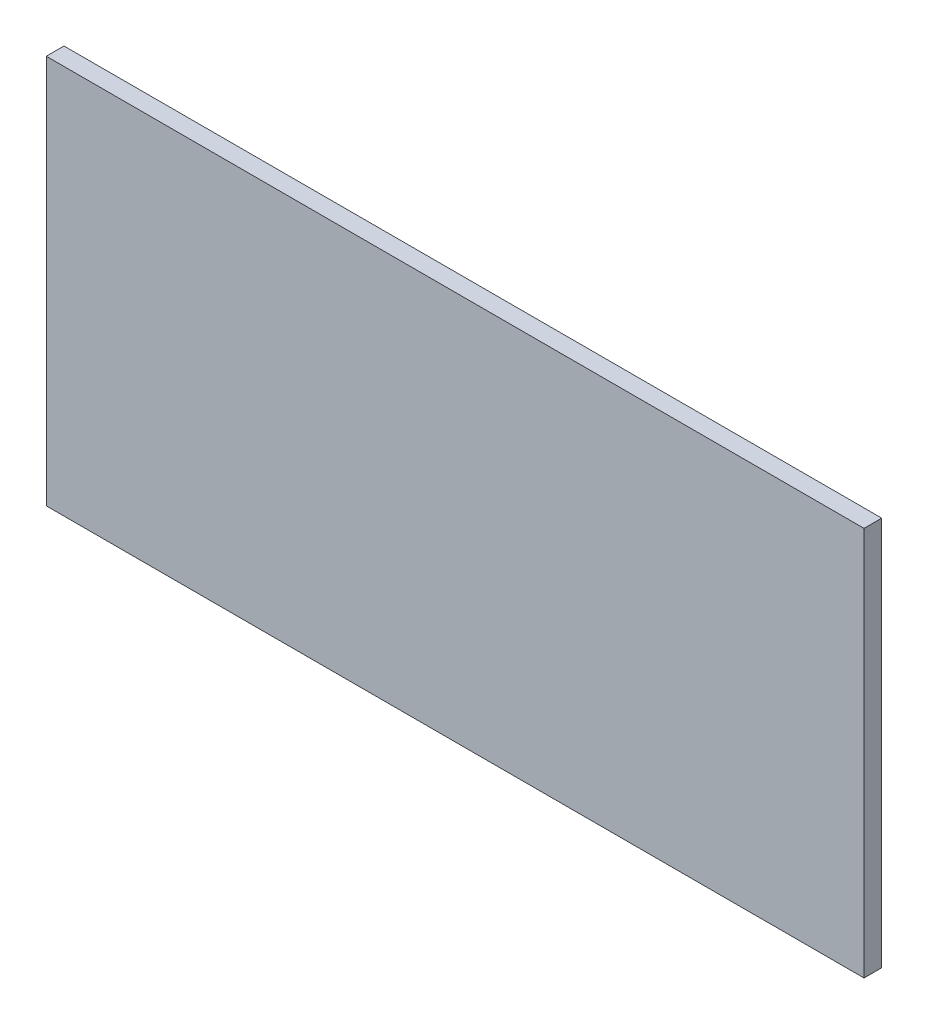
ISO-10303-21;
HEADER;
FILE_DESCRIPTION(('STEP AP214'),'2;1');
FILE_NAME('part.step','',(''),(''),'','','');
FILE_SCHEMA(('AUTOMOTIVE_DESIGN { 1 0 10303 214 1 1 1 1 }'));
ENDSEC;
DATA;
#1=APPLICATION_CONTEXT('core data for automotive mechanical design processes');
#2=APPLICATION_PROTOCOL_DEFINITION('international standard','automotive_design',2000,#1);
#3=PRODUCT_CONTEXT('',#1,'mechanical');
#4=PRODUCT('Part','Part','',(#3));
#5=PRODUCT_RELATED_PRODUCT_CATEGORY('part','',(#4));
#6=PRODUCT_DEFINITION_FORMATION('','',#4);
#7=PRODUCT_DEFINITION_CONTEXT('part definition',#1,'design');
#8=PRODUCT_DEFINITION('design','',#6,#7);
#9=PRODUCT_DEFINITION_SHAPE('','',#8);
#10=(LENGTH_UNIT() NAMED_UNIT(*) SI_UNIT(.MILLI.,.METRE.));
#11=(NAMED_UNIT(*) PLANE_ANGLE_UNIT() SI_UNIT($,.RADIAN.));
#12=(NAMED_UNIT(*) SI_UNIT($,.STERADIAN.) SOLID_ANGLE_UNIT());
#13=UNCERTAINTY_MEASURE_WITH_UNIT(LENGTH_MEASURE(1.E-05),#10,'distance_accuracy_value','');
#14=(GEOMETRIC_REPRESENTATION_CONTEXT(3) GLOBAL_UNCERTAINTY_ASSIGNED_CONTEXT((#13)) GLOBAL_UNIT_ASSIGNED_CONTEXT((#10,
#11,#12)) REPRESENTATION_CONTEXT('',''));
#15=CARTESIAN_POINT('',(0.,0.,0.));
#16=DIRECTION('',(0.,0.,1.));
#17=DIRECTION('',(1.,0.,0.));
#18=AXIS2_PLACEMENT_3D('',#15,#16,#17);
#19=CARTESIAN_POINT('',(115.5,-55.,5.));
#20=DIRECTION('',(-1.,0.,0.));
#21=DIRECTION('',(0.,0.,1.));
#22=AXIS2_PLACEMENT_3D('',#19,#20,#21);
#23=PLANE('',#22);
#24=DIRECTION('',(0.,1.,0.));
#25=VECTOR('',#24,1.);
#26=CARTESIAN_POINT('',(115.5,-55.,0.));
#27=LINE('',#26,#25);
#28=CARTESIAN_POINT('',(115.5,-55.,0.));
#29=VERTEX_POINT('',#28);
#30=CARTESIAN_POINT('',(115.5,55.,0.));
#31=VERTEX_POINT('',#30);
#32=EDGE_CURVE('E100',#29,#31,#27,.T.);
#33=ORIENTED_EDGE('',*,*,#32,.T.);
#34=DIRECTION('',(0.,0.,-1.));
#35=VECTOR('',#34,1.);
#36=CARTESIAN_POINT('',(115.5,55.,5.));
#37=LINE('',#36,#35);
#38=CARTESIAN_POINT('',(115.5,55.,5.));
#39=VERTEX_POINT('',#38);
#40=EDGE_CURVE('E11',#39,#31,#37,.T.);
#41=ORIENTED_EDGE('',*,*,#40,.F.);
#42=DIRECTION('',(0.,1.,0.));
#43=VECTOR('',#42,1.);
#44=CARTESIAN_POINT('',(115.5,-55.,5.));
#45=LINE('',#44,#43);
#46=CARTESIAN_POINT('',(115.5,-55.,5.));
#47=VERTEX_POINT('',#46);
#48=EDGE_CURVE('E88',#47,#39,#45,.T.);
#49=ORIENTED_EDGE('',*,*,#48,.F.);
#50=DIRECTION('',(0.,0.,-1.));
#51=VECTOR('',#50,1.);
#52=CARTESIAN_POINT('',(115.5,-55.,5.));
#53=LINE('',#52,#51);
#54=EDGE_CURVE('E96',#47,#29,#53,.T.);
#55=ORIENTED_EDGE('',*,*,#54,.T.);
#56=EDGE_LOOP('',(#33,#41,#49,#55));
#57=FACE_BOUND('',#56,.T.);
#58=ADVANCED_FACE('F37',(#57),#23,.F.);
#59=CARTESIAN_POINT('',(-115.5,55.,5.));
#60=DIRECTION('',(0.,-1.,0.));
#61=DIRECTION('',(0.,0.,-1.));
#62=AXIS2_PLACEMENT_3D('',#59,#60,#61);
#63=PLANE('',#62);
#64=DIRECTION('',(-1.,0.,0.));
#65=VECTOR('',#64,1.);
#66=CARTESIAN_POINT('',(-115.5,55.,0.));
#67=LINE('',#66,#65);
#68=CARTESIAN_POINT('',(-115.5,55.,0.));
#69=VERTEX_POINT('',#68);
#70=EDGE_CURVE('E92',#31,#69,#67,.T.);
#71=ORIENTED_EDGE('',*,*,#70,.T.);
#72=DIRECTION('',(0.,0.,-1.));
#73=VECTOR('',#72,1.);
#74=CARTESIAN_POINT('',(-115.5,55.,5.));
#75=LINE('',#74,#73);
#76=CARTESIAN_POINT('',(-115.5,55.,5.));
#77=VERTEX_POINT('',#76);
#78=EDGE_CURVE('E45',#77,#69,#75,.T.);
#79=ORIENTED_EDGE('',*,*,#78,.F.);
#80=DIRECTION('',(-1.,0.,0.));
#81=VECTOR('',#80,1.);
#82=CARTESIAN_POINT('',(-115.5,55.,5.));
#83=LINE('',#82,#81);
#84=EDGE_CURVE('E83',#39,#77,#83,.T.);
#85=ORIENTED_EDGE('',*,*,#84,.F.);
#86=ORIENTED_EDGE('',*,*,#40,.T.);
#87=EDGE_LOOP('',(#71,#79,#85,#86));
#88=FACE_BOUND('',#87,.T.);
#89=ADVANCED_FACE('F91',(#88),#63,.F.);
#90=CARTESIAN_POINT('',(-115.5,-55.,5.));
#91=DIRECTION('',(1.,0.,0.));
#92=DIRECTION('',(0.,0.,-1.));
#93=AXIS2_PLACEMENT_3D('',#90,#91,#92);
#94=PLANE('',#93);
#95=DIRECTION('',(0.,-1.,0.));
#96=VECTOR('',#95,1.);
#97=CARTESIAN_POINT('',(-115.5,-55.,0.));
#98=LINE('',#97,#96);
#99=CARTESIAN_POINT('',(-115.5,-55.,0.));
#100=VERTEX_POINT('',#99);
#101=EDGE_CURVE('E70',#69,#100,#98,.T.);
#102=ORIENTED_EDGE('',*,*,#101,.T.);
#103=DIRECTION('',(0.,0.,-1.));
#104=VECTOR('',#103,1.);
#105=CARTESIAN_POINT('',(-115.5,-55.,5.));
#106=LINE('',#105,#104);
#107=CARTESIAN_POINT('',(-115.5,-55.,5.));
#108=VERTEX_POINT('',#107);
#109=EDGE_CURVE('E93',#108,#100,#106,.T.);
#110=ORIENTED_EDGE('',*,*,#109,.F.);
#111=DIRECTION('',(0.,-1.,0.));
#112=VECTOR('',#111,1.);
#113=CARTESIAN_POINT('',(-115.5,-55.,5.));
#114=LINE('',#113,#112);
#115=EDGE_CURVE('E86',#77,#108,#114,.T.);
#116=ORIENTED_EDGE('',*,*,#115,.F.);
#117=ORIENTED_EDGE('',*,*,#78,.T.);
#118=EDGE_LOOP('',(#102,#110,#116,#117));
#119=FACE_BOUND('',#118,.T.);
#120=ADVANCED_FACE('F94',(#119),#94,.F.);
#121=CARTESIAN_POINT('',(-115.5,-55.,5.));
#122=DIRECTION('',(0.,1.,0.));
#123=DIRECTION('',(0.,0.,1.));
#124=AXIS2_PLACEMENT_3D('',#121,#122,#123);
#125=PLANE('',#124);
#126=DIRECTION('',(1.,0.,0.));
#127=VECTOR('',#126,1.);
#128=CARTESIAN_POINT('',(-115.5,-55.,0.));
#129=LINE('',#128,#127);
#130=EDGE_CURVE('E76',#100,#29,#129,.T.);
#131=ORIENTED_EDGE('',*,*,#130,.T.);
#132=ORIENTED_EDGE('',*,*,#54,.F.);
#133=DIRECTION('',(1.,0.,0.));
#134=VECTOR('',#133,1.);
#135=CARTESIAN_POINT('',(-115.5,-55.,5.));
#136=LINE('',#135,#134);
#137=EDGE_CURVE('E53',#108,#47,#136,.T.);
#138=ORIENTED_EDGE('',*,*,#137,.F.);
#139=ORIENTED_EDGE('',*,*,#109,.T.);
#140=EDGE_LOOP('',(#131,#132,#138,#139));
#141=FACE_BOUND('',#140,.T.);
#142=ADVANCED_FACE('F107',(#141),#125,.F.);
#143=CARTESIAN_POINT('',(0.,0.,5.));
#144=DIRECTION('',(0.,0.,-1.));
#145=DIRECTION('',(-1.,0.,0.));
#146=AXIS2_PLACEMENT_3D('',#143,#144,#145);
#147=PLANE('',#146);
#148=ORIENTED_EDGE('',*,*,#48,.T.);
#149=ORIENTED_EDGE('',*,*,#84,.T.);
#150=ORIENTED_EDGE('',*,*,#115,.T.);
#151=ORIENTED_EDGE('',*,*,#137,.T.);
#152=EDGE_LOOP('',(#148,#149,#150,#151));
#153=FACE_BOUND('',#152,.T.);
#154=ADVANCED_FACE('F84',(#153),#147,.F.);
#155=CARTESIAN_POINT('',(0.,0.,0.));
#156=DIRECTION('',(0.,0.,-1.));
#157=DIRECTION('',(-1.,0.,0.));
#158=AXIS2_PLACEMENT_3D('',#155,#156,#157);
#159=PLANE('',#158);
#160=ORIENTED_EDGE('',*,*,#32,.F.);
#161=ORIENTED_EDGE('',*,*,#130,.F.);
#162=ORIENTED_EDGE('',*,*,#101,.F.);
#163=ORIENTED_EDGE('',*,*,#70,.F.);
#164=EDGE_LOOP('',(#160,#161,#162,#163));
#165=FACE_BOUND('',#164,.T.);
#166=ADVANCED_FACE('F110',(#165),#159,.T.);
#167=CLOSED_SHELL('',(#58,#89,#120,#142,#154,#166));
#168=MANIFOLD_SOLID_BREP('B2',#167);
#169=ADVANCED_BREP_SHAPE_REPRESENTATION('',(#18,#168),#14);
#170=SHAPE_DEFINITION_REPRESENTATION(#9,#169);
ENDSEC;
END-ISO-10303-21;
